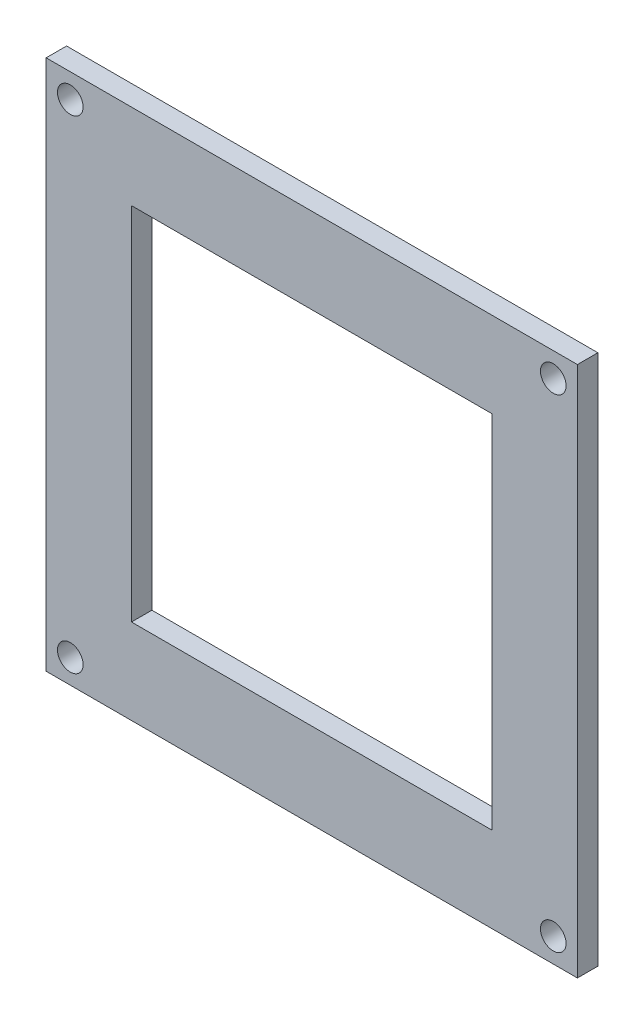
ISO-10303-21;
HEADER;
FILE_DESCRIPTION(('STEP AP214'),'2;1');
FILE_NAME('part.step','',(''),(''),'','','');
FILE_SCHEMA(('AUTOMOTIVE_DESIGN { 1 0 10303 214 1 1 1 1 }'));
ENDSEC;
DATA;
#1=APPLICATION_CONTEXT('core data for automotive mechanical design processes');
#2=APPLICATION_PROTOCOL_DEFINITION('international standard','automotive_design',2000,#1);
#3=PRODUCT_CONTEXT('',#1,'mechanical');
#4=PRODUCT('Part','Part','',(#3));
#5=PRODUCT_RELATED_PRODUCT_CATEGORY('part','',(#4));
#6=PRODUCT_DEFINITION_FORMATION('','',#4);
#7=PRODUCT_DEFINITION_CONTEXT('part definition',#1,'design');
#8=PRODUCT_DEFINITION('design','',#6,#7);
#9=PRODUCT_DEFINITION_SHAPE('','',#8);
#10=(LENGTH_UNIT() NAMED_UNIT(*) SI_UNIT(.MILLI.,.METRE.));
#11=(NAMED_UNIT(*) PLANE_ANGLE_UNIT() SI_UNIT($,.RADIAN.));
#12=(NAMED_UNIT(*) SI_UNIT($,.STERADIAN.) SOLID_ANGLE_UNIT());
#13=UNCERTAINTY_MEASURE_WITH_UNIT(LENGTH_MEASURE(1.E-05),#10,'distance_accuracy_value','');
#14=(GEOMETRIC_REPRESENTATION_CONTEXT(3) GLOBAL_UNCERTAINTY_ASSIGNED_CONTEXT((#13)) GLOBAL_UNIT_ASSIGNED_CONTEXT((#10,
#11,#12)) REPRESENTATION_CONTEXT('',''));
#15=CARTESIAN_POINT('',(0.,0.,0.));
#16=DIRECTION('',(0.,0.,1.));
#17=DIRECTION('',(1.,0.,0.));
#18=AXIS2_PLACEMENT_3D('',#15,#16,#17);
#19=CARTESIAN_POINT('',(0.,0.,2.54));
#20=DIRECTION('',(0.,0.,1.));
#21=DIRECTION('',(1.,0.,0.));
#22=AXIS2_PLACEMENT_3D('',#19,#20,#21);
#23=PLANE('',#22);
#24=CARTESIAN_POINT('',(-30.,-30.,2.54));
#25=DIRECTION('',(0.,0.,1.));
#26=DIRECTION('',(1.,0.,0.));
#27=AXIS2_PLACEMENT_3D('',#24,#25,#26);
#28=CIRCLE('',#27,1.59);
#29=CARTESIAN_POINT('',(-28.41,-30.,2.54));
#30=VERTEX_POINT('',#29);
#31=EDGE_CURVE('E253',#30,#30,#28,.T.);
#32=ORIENTED_EDGE('',*,*,#31,.F.);
#33=EDGE_LOOP('',(#32));
#34=FACE_BOUND('',#33,.T.);
#35=CARTESIAN_POINT('',(30.,30.,2.54));
#36=DIRECTION('',(0.,0.,1.));
#37=DIRECTION('',(1.,0.,0.));
#38=AXIS2_PLACEMENT_3D('',#35,#36,#37);
#39=CIRCLE('',#38,1.59);
#40=CARTESIAN_POINT('',(31.59,30.,2.54));
#41=VERTEX_POINT('',#40);
#42=EDGE_CURVE('E135',#41,#41,#39,.T.);
#43=ORIENTED_EDGE('',*,*,#42,.F.);
#44=EDGE_LOOP('',(#43));
#45=FACE_BOUND('',#44,.T.);
#46=DIRECTION('',(0.,1.,0.));
#47=VECTOR('',#46,1.);
#48=CARTESIAN_POINT('',(33.,33.,2.54));
#49=LINE('',#48,#47);
#50=CARTESIAN_POINT('',(33.,-33.,2.54));
#51=VERTEX_POINT('',#50);
#52=CARTESIAN_POINT('',(33.,33.,2.54));
#53=VERTEX_POINT('',#52);
#54=EDGE_CURVE('E145',#51,#53,#49,.T.);
#55=ORIENTED_EDGE('',*,*,#54,.T.);
#56=DIRECTION('',(-1.,0.,0.));
#57=VECTOR('',#56,1.);
#58=CARTESIAN_POINT('',(-33.,33.,2.54));
#59=LINE('',#58,#57);
#60=CARTESIAN_POINT('',(-33.,33.,2.54));
#61=VERTEX_POINT('',#60);
#62=EDGE_CURVE('E148',#53,#61,#59,.T.);
#63=ORIENTED_EDGE('',*,*,#62,.T.);
#64=DIRECTION('',(0.,-1.,0.));
#65=VECTOR('',#64,1.);
#66=CARTESIAN_POINT('',(-33.,33.,2.54));
#67=LINE('',#66,#65);
#68=CARTESIAN_POINT('',(-33.,-33.,2.54));
#69=VERTEX_POINT('',#68);
#70=EDGE_CURVE('E151',#61,#69,#67,.T.);
#71=ORIENTED_EDGE('',*,*,#70,.T.);
#72=DIRECTION('',(1.,0.,0.));
#73=VECTOR('',#72,1.);
#74=CARTESIAN_POINT('',(-33.,-33.,2.54));
#75=LINE('',#74,#73);
#76=EDGE_CURVE('E153',#69,#51,#75,.T.);
#77=ORIENTED_EDGE('',*,*,#76,.T.);
#78=EDGE_LOOP('',(#55,#63,#71,#77));
#79=FACE_BOUND('',#78,.T.);
#80=DIRECTION('',(-1.,0.,0.));
#81=VECTOR('',#80,1.);
#82=CARTESIAN_POINT('',(-22.4,22.4,2.54));
#83=LINE('',#82,#81);
#84=CARTESIAN_POINT('',(22.4,22.4,2.54));
#85=VERTEX_POINT('',#84);
#86=CARTESIAN_POINT('',(-22.4,22.4,2.54));
#87=VERTEX_POINT('',#86);
#88=EDGE_CURVE('E114',#85,#87,#83,.T.);
#89=ORIENTED_EDGE('',*,*,#88,.F.);
#90=DIRECTION('',(0.,1.,0.));
#91=VECTOR('',#90,1.);
#92=CARTESIAN_POINT('',(22.4,22.4,2.54));
#93=LINE('',#92,#91);
#94=CARTESIAN_POINT('',(22.4,-22.4,2.54));
#95=VERTEX_POINT('',#94);
#96=EDGE_CURVE('E106',#95,#85,#93,.T.);
#97=ORIENTED_EDGE('',*,*,#96,.F.);
#98=DIRECTION('',(1.,0.,0.));
#99=VECTOR('',#98,1.);
#100=CARTESIAN_POINT('',(-22.4,-22.4,2.54));
#101=LINE('',#100,#99);
#102=CARTESIAN_POINT('',(-22.4,-22.4,2.54));
#103=VERTEX_POINT('',#102);
#104=EDGE_CURVE('E129',#103,#95,#101,.T.);
#105=ORIENTED_EDGE('',*,*,#104,.F.);
#106=DIRECTION('',(0.,-1.,0.));
#107=VECTOR('',#106,1.);
#108=CARTESIAN_POINT('',(-22.4,22.4,2.54));
#109=LINE('',#108,#107);
#110=EDGE_CURVE('E127',#87,#103,#109,.T.);
#111=ORIENTED_EDGE('',*,*,#110,.F.);
#112=EDGE_LOOP('',(#89,#97,#105,#111));
#113=FACE_BOUND('',#112,.T.);
#114=CARTESIAN_POINT('',(-30.,30.,2.54));
#115=DIRECTION('',(0.,0.,1.));
#116=DIRECTION('',(1.,0.,0.));
#117=AXIS2_PLACEMENT_3D('',#114,#115,#116);
#118=CIRCLE('',#117,1.59);
#119=CARTESIAN_POINT('',(-28.41,30.,2.54));
#120=VERTEX_POINT('',#119);
#121=EDGE_CURVE('E259',#120,#120,#118,.T.);
#122=ORIENTED_EDGE('',*,*,#121,.F.);
#123=EDGE_LOOP('',(#122));
#124=FACE_BOUND('',#123,.T.);
#125=CARTESIAN_POINT('',(30.,-30.,2.54));
#126=DIRECTION('',(0.,0.,1.));
#127=DIRECTION('',(1.,0.,0.));
#128=AXIS2_PLACEMENT_3D('',#125,#126,#127);
#129=CIRCLE('',#128,1.59);
#130=CARTESIAN_POINT('',(31.59,-30.,2.54));
#131=VERTEX_POINT('',#130);
#132=EDGE_CURVE('E244',#131,#131,#129,.T.);
#133=ORIENTED_EDGE('',*,*,#132,.F.);
#134=EDGE_LOOP('',(#133));
#135=FACE_BOUND('',#134,.T.);
#136=ADVANCED_FACE('F41',(#34,#45,#79,#113,#124,#135),#23,.T.);
#137=CARTESIAN_POINT('',(0.,0.,0.));
#138=DIRECTION('',(0.,0.,1.));
#139=DIRECTION('',(1.,0.,0.));
#140=AXIS2_PLACEMENT_3D('',#137,#138,#139);
#141=PLANE('',#140);
#142=DIRECTION('',(0.,1.,0.));
#143=VECTOR('',#142,1.);
#144=CARTESIAN_POINT('',(33.,33.,0.));
#145=LINE('',#144,#143);
#146=CARTESIAN_POINT('',(33.,-33.,0.));
#147=VERTEX_POINT('',#146);
#148=CARTESIAN_POINT('',(33.,33.,0.));
#149=VERTEX_POINT('',#148);
#150=EDGE_CURVE('E122',#147,#149,#145,.T.);
#151=ORIENTED_EDGE('',*,*,#150,.F.);
#152=DIRECTION('',(1.,0.,0.));
#153=VECTOR('',#152,1.);
#154=CARTESIAN_POINT('',(-33.,-33.,0.));
#155=LINE('',#154,#153);
#156=CARTESIAN_POINT('',(-33.,-33.,0.));
#157=VERTEX_POINT('',#156);
#158=EDGE_CURVE('E149',#157,#147,#155,.T.);
#159=ORIENTED_EDGE('',*,*,#158,.F.);
#160=DIRECTION('',(0.,-1.,0.));
#161=VECTOR('',#160,1.);
#162=CARTESIAN_POINT('',(-33.,33.,0.));
#163=LINE('',#162,#161);
#164=CARTESIAN_POINT('',(-33.,33.,0.));
#165=VERTEX_POINT('',#164);
#166=EDGE_CURVE('E160',#165,#157,#163,.T.);
#167=ORIENTED_EDGE('',*,*,#166,.F.);
#168=DIRECTION('',(-1.,0.,0.));
#169=VECTOR('',#168,1.);
#170=CARTESIAN_POINT('',(-33.,33.,0.));
#171=LINE('',#170,#169);
#172=EDGE_CURVE('E158',#149,#165,#171,.T.);
#173=ORIENTED_EDGE('',*,*,#172,.F.);
#174=EDGE_LOOP('',(#151,#159,#167,#173));
#175=FACE_BOUND('',#174,.T.);
#176=DIRECTION('',(0.,1.,0.));
#177=VECTOR('',#176,1.);
#178=CARTESIAN_POINT('',(22.4,22.4,0.));
#179=LINE('',#178,#177);
#180=CARTESIAN_POINT('',(22.4,-22.4,0.));
#181=VERTEX_POINT('',#180);
#182=CARTESIAN_POINT('',(22.4,22.4,0.));
#183=VERTEX_POINT('',#182);
#184=EDGE_CURVE('E64',#181,#183,#179,.T.);
#185=ORIENTED_EDGE('',*,*,#184,.T.);
#186=DIRECTION('',(-1.,0.,0.));
#187=VECTOR('',#186,1.);
#188=CARTESIAN_POINT('',(-22.4,22.4,0.));
#189=LINE('',#188,#187);
#190=CARTESIAN_POINT('',(-22.4,22.4,0.));
#191=VERTEX_POINT('',#190);
#192=EDGE_CURVE('E121',#183,#191,#189,.T.);
#193=ORIENTED_EDGE('',*,*,#192,.T.);
#194=DIRECTION('',(0.,-1.,0.));
#195=VECTOR('',#194,1.);
#196=CARTESIAN_POINT('',(-22.4,22.4,0.));
#197=LINE('',#196,#195);
#198=CARTESIAN_POINT('',(-22.4,-22.4,0.));
#199=VERTEX_POINT('',#198);
#200=EDGE_CURVE('E137',#191,#199,#197,.T.);
#201=ORIENTED_EDGE('',*,*,#200,.T.);
#202=DIRECTION('',(1.,0.,0.));
#203=VECTOR('',#202,1.);
#204=CARTESIAN_POINT('',(-22.4,-22.4,0.));
#205=LINE('',#204,#203);
#206=EDGE_CURVE('E115',#199,#181,#205,.T.);
#207=ORIENTED_EDGE('',*,*,#206,.T.);
#208=EDGE_LOOP('',(#185,#193,#201,#207));
#209=FACE_BOUND('',#208,.T.);
#210=CARTESIAN_POINT('',(30.,30.,0.));
#211=DIRECTION('',(0.,0.,1.));
#212=DIRECTION('',(1.,0.,0.));
#213=AXIS2_PLACEMENT_3D('',#210,#211,#212);
#214=CIRCLE('',#213,1.59);
#215=CARTESIAN_POINT('',(31.59,30.,0.));
#216=VERTEX_POINT('',#215);
#217=EDGE_CURVE('E262',#216,#216,#214,.T.);
#218=ORIENTED_EDGE('',*,*,#217,.T.);
#219=EDGE_LOOP('',(#218));
#220=FACE_BOUND('',#219,.T.);
#221=CARTESIAN_POINT('',(-30.,30.,0.));
#222=DIRECTION('',(0.,0.,1.));
#223=DIRECTION('',(1.,0.,0.));
#224=AXIS2_PLACEMENT_3D('',#221,#222,#223);
#225=CIRCLE('',#224,1.59);
#226=CARTESIAN_POINT('',(-28.41,30.,0.));
#227=VERTEX_POINT('',#226);
#228=EDGE_CURVE('E256',#227,#227,#225,.T.);
#229=ORIENTED_EDGE('',*,*,#228,.T.);
#230=EDGE_LOOP('',(#229));
#231=FACE_BOUND('',#230,.T.);
#232=CARTESIAN_POINT('',(-30.,-30.,0.));
#233=DIRECTION('',(0.,0.,1.));
#234=DIRECTION('',(1.,0.,0.));
#235=AXIS2_PLACEMENT_3D('',#232,#233,#234);
#236=CIRCLE('',#235,1.59);
#237=CARTESIAN_POINT('',(-28.41,-30.,0.));
#238=VERTEX_POINT('',#237);
#239=EDGE_CURVE('E250',#238,#238,#236,.T.);
#240=ORIENTED_EDGE('',*,*,#239,.T.);
#241=EDGE_LOOP('',(#240));
#242=FACE_BOUND('',#241,.T.);
#243=CARTESIAN_POINT('',(30.,-30.,0.));
#244=DIRECTION('',(0.,0.,1.));
#245=DIRECTION('',(1.,0.,0.));
#246=AXIS2_PLACEMENT_3D('',#243,#244,#245);
#247=CIRCLE('',#246,1.59);
#248=CARTESIAN_POINT('',(31.59,-30.,0.));
#249=VERTEX_POINT('',#248);
#250=EDGE_CURVE('E247',#249,#249,#247,.T.);
#251=ORIENTED_EDGE('',*,*,#250,.T.);
#252=EDGE_LOOP('',(#251));
#253=FACE_BOUND('',#252,.T.);
#254=ADVANCED_FACE('F178',(#175,#209,#220,#231,#242,#253),#141,.F.);
#255=CARTESIAN_POINT('',(33.,33.,2.54));
#256=DIRECTION('',(-1.,0.,0.));
#257=DIRECTION('',(0.,-1.,0.));
#258=AXIS2_PLACEMENT_3D('',#255,#256,#257);
#259=PLANE('',#258);
#260=ORIENTED_EDGE('',*,*,#150,.T.);
#261=DIRECTION('',(0.,0.,-1.));
#262=VECTOR('',#261,1.);
#263=CARTESIAN_POINT('',(33.,33.,2.54));
#264=LINE('',#263,#262);
#265=EDGE_CURVE('E11',#53,#149,#264,.T.);
#266=ORIENTED_EDGE('',*,*,#265,.F.);
#267=ORIENTED_EDGE('',*,*,#54,.F.);
#268=DIRECTION('',(0.,0.,-1.));
#269=VECTOR('',#268,1.);
#270=CARTESIAN_POINT('',(33.,-33.,2.54));
#271=LINE('',#270,#269);
#272=EDGE_CURVE('E155',#51,#147,#271,.T.);
#273=ORIENTED_EDGE('',*,*,#272,.T.);
#274=EDGE_LOOP('',(#260,#266,#267,#273));
#275=FACE_BOUND('',#274,.T.);
#276=ADVANCED_FACE('F43',(#275),#259,.F.);
#277=CARTESIAN_POINT('',(-33.,33.,2.54));
#278=DIRECTION('',(0.,-1.,0.));
#279=DIRECTION('',(0.,0.,-1.));
#280=AXIS2_PLACEMENT_3D('',#277,#278,#279);
#281=PLANE('',#280);
#282=ORIENTED_EDGE('',*,*,#172,.T.);
#283=DIRECTION('',(0.,0.,-1.));
#284=VECTOR('',#283,1.);
#285=CARTESIAN_POINT('',(-33.,33.,2.54));
#286=LINE('',#285,#284);
#287=EDGE_CURVE('E49',#61,#165,#286,.T.);
#288=ORIENTED_EDGE('',*,*,#287,.F.);
#289=ORIENTED_EDGE('',*,*,#62,.F.);
#290=ORIENTED_EDGE('',*,*,#265,.T.);
#291=EDGE_LOOP('',(#282,#288,#289,#290));
#292=FACE_BOUND('',#291,.T.);
#293=ADVANCED_FACE('F188',(#292),#281,.F.);
#294=CARTESIAN_POINT('',(-33.,33.,2.54));
#295=DIRECTION('',(1.,0.,0.));
#296=DIRECTION('',(0.,0.,-1.));
#297=AXIS2_PLACEMENT_3D('',#294,#295,#296);
#298=PLANE('',#297);
#299=ORIENTED_EDGE('',*,*,#166,.T.);
#300=DIRECTION('',(0.,0.,-1.));
#301=VECTOR('',#300,1.);
#302=CARTESIAN_POINT('',(-33.,-33.,2.54));
#303=LINE('',#302,#301);
#304=EDGE_CURVE('E165',#69,#157,#303,.T.);
#305=ORIENTED_EDGE('',*,*,#304,.F.);
#306=ORIENTED_EDGE('',*,*,#70,.F.);
#307=ORIENTED_EDGE('',*,*,#287,.T.);
#308=EDGE_LOOP('',(#299,#305,#306,#307));
#309=FACE_BOUND('',#308,.T.);
#310=ADVANCED_FACE('F172',(#309),#298,.F.);
#311=CARTESIAN_POINT('',(-33.,-33.,2.54));
#312=DIRECTION('',(0.,1.,0.));
#313=DIRECTION('',(-1.,0.,0.));
#314=AXIS2_PLACEMENT_3D('',#311,#312,#313);
#315=PLANE('',#314);
#316=ORIENTED_EDGE('',*,*,#158,.T.);
#317=ORIENTED_EDGE('',*,*,#272,.F.);
#318=ORIENTED_EDGE('',*,*,#76,.F.);
#319=ORIENTED_EDGE('',*,*,#304,.T.);
#320=EDGE_LOOP('',(#316,#317,#318,#319));
#321=FACE_BOUND('',#320,.T.);
#322=ADVANCED_FACE('F182',(#321),#315,.F.);
#323=CARTESIAN_POINT('',(22.4,22.4,2.54));
#324=DIRECTION('',(-1.,0.,0.));
#325=DIRECTION('',(0.,0.,1.));
#326=AXIS2_PLACEMENT_3D('',#323,#324,#325);
#327=PLANE('',#326);
#328=ORIENTED_EDGE('',*,*,#184,.F.);
#329=DIRECTION('',(0.,0.,-1.));
#330=VECTOR('',#329,1.);
#331=CARTESIAN_POINT('',(22.4,-22.4,2.54));
#332=LINE('',#331,#330);
#333=EDGE_CURVE('E110',#95,#181,#332,.T.);
#334=ORIENTED_EDGE('',*,*,#333,.F.);
#335=ORIENTED_EDGE('',*,*,#96,.T.);
#336=DIRECTION('',(0.,0.,-1.));
#337=VECTOR('',#336,1.);
#338=CARTESIAN_POINT('',(22.4,22.4,2.54));
#339=LINE('',#338,#337);
#340=EDGE_CURVE('E109',#85,#183,#339,.T.);
#341=ORIENTED_EDGE('',*,*,#340,.T.);
#342=EDGE_LOOP('',(#328,#334,#335,#341));
#343=FACE_BOUND('',#342,.T.);
#344=ADVANCED_FACE('F108',(#343),#327,.T.);
#345=CARTESIAN_POINT('',(-22.4,22.4,2.54));
#346=DIRECTION('',(0.,-1.,0.));
#347=DIRECTION('',(0.,0.,-1.));
#348=AXIS2_PLACEMENT_3D('',#345,#346,#347);
#349=PLANE('',#348);
#350=ORIENTED_EDGE('',*,*,#192,.F.);
#351=ORIENTED_EDGE('',*,*,#340,.F.);
#352=ORIENTED_EDGE('',*,*,#88,.T.);
#353=DIRECTION('',(0.,0.,-1.));
#354=VECTOR('',#353,1.);
#355=CARTESIAN_POINT('',(-22.4,22.4,2.54));
#356=LINE('',#355,#354);
#357=EDGE_CURVE('E123',#87,#191,#356,.T.);
#358=ORIENTED_EDGE('',*,*,#357,.T.);
#359=EDGE_LOOP('',(#350,#351,#352,#358));
#360=FACE_BOUND('',#359,.T.);
#361=ADVANCED_FACE('F118',(#360),#349,.T.);
#362=CARTESIAN_POINT('',(-22.4,22.4,2.54));
#363=DIRECTION('',(1.,0.,0.));
#364=DIRECTION('',(0.,0.,-1.));
#365=AXIS2_PLACEMENT_3D('',#362,#363,#364);
#366=PLANE('',#365);
#367=ORIENTED_EDGE('',*,*,#200,.F.);
#368=ORIENTED_EDGE('',*,*,#357,.F.);
#369=ORIENTED_EDGE('',*,*,#110,.T.);
#370=DIRECTION('',(0.,0.,-1.));
#371=VECTOR('',#370,1.);
#372=CARTESIAN_POINT('',(-22.4,-22.4,2.54));
#373=LINE('',#372,#371);
#374=EDGE_CURVE('E56',#103,#199,#373,.T.);
#375=ORIENTED_EDGE('',*,*,#374,.T.);
#376=EDGE_LOOP('',(#367,#368,#369,#375));
#377=FACE_BOUND('',#376,.T.);
#378=ADVANCED_FACE('F214',(#377),#366,.T.);
#379=CARTESIAN_POINT('',(-22.4,-22.4,2.54));
#380=DIRECTION('',(0.,1.,0.));
#381=DIRECTION('',(0.,0.,1.));
#382=AXIS2_PLACEMENT_3D('',#379,#380,#381);
#383=PLANE('',#382);
#384=ORIENTED_EDGE('',*,*,#206,.F.);
#385=ORIENTED_EDGE('',*,*,#374,.F.);
#386=ORIENTED_EDGE('',*,*,#104,.T.);
#387=ORIENTED_EDGE('',*,*,#333,.T.);
#388=EDGE_LOOP('',(#384,#385,#386,#387));
#389=FACE_BOUND('',#388,.T.);
#390=ADVANCED_FACE('F218',(#389),#383,.T.);
#391=CARTESIAN_POINT('',(30.,30.,2.54));
#392=DIRECTION('',(0.,0.,-1.));
#393=DIRECTION('',(-1.,0.,0.));
#394=AXIS2_PLACEMENT_3D('',#391,#392,#393);
#395=CYLINDRICAL_SURFACE('',#394,1.59);
#396=ORIENTED_EDGE('',*,*,#42,.T.);
#397=EDGE_LOOP('',(#396));
#398=FACE_BOUND('',#397,.T.);
#399=ORIENTED_EDGE('',*,*,#217,.F.);
#400=EDGE_LOOP('',(#399));
#401=FACE_BOUND('',#400,.T.);
#402=ADVANCED_FACE('F224',(#398,#401),#395,.F.);
#403=CARTESIAN_POINT('',(-30.,30.,2.54));
#404=DIRECTION('',(0.,0.,-1.));
#405=DIRECTION('',(-1.,0.,0.));
#406=AXIS2_PLACEMENT_3D('',#403,#404,#405);
#407=CYLINDRICAL_SURFACE('',#406,1.59);
#408=ORIENTED_EDGE('',*,*,#121,.T.);
#409=EDGE_LOOP('',(#408));
#410=FACE_BOUND('',#409,.T.);
#411=ORIENTED_EDGE('',*,*,#228,.F.);
#412=EDGE_LOOP('',(#411));
#413=FACE_BOUND('',#412,.T.);
#414=ADVANCED_FACE('F227',(#410,#413),#407,.F.);
#415=CARTESIAN_POINT('',(-30.,-30.,2.54));
#416=DIRECTION('',(0.,0.,-1.));
#417=DIRECTION('',(-1.,0.,0.));
#418=AXIS2_PLACEMENT_3D('',#415,#416,#417);
#419=CYLINDRICAL_SURFACE('',#418,1.59);
#420=ORIENTED_EDGE('',*,*,#31,.T.);
#421=EDGE_LOOP('',(#420));
#422=FACE_BOUND('',#421,.T.);
#423=ORIENTED_EDGE('',*,*,#239,.F.);
#424=EDGE_LOOP('',(#423));
#425=FACE_BOUND('',#424,.T.);
#426=ADVANCED_FACE('F231',(#422,#425),#419,.F.);
#427=CARTESIAN_POINT('',(30.,-30.,2.54));
#428=DIRECTION('',(0.,0.,-1.));
#429=DIRECTION('',(-1.,0.,0.));
#430=AXIS2_PLACEMENT_3D('',#427,#428,#429);
#431=CYLINDRICAL_SURFACE('',#430,1.59);
#432=ORIENTED_EDGE('',*,*,#132,.T.);
#433=EDGE_LOOP('',(#432));
#434=FACE_BOUND('',#433,.T.);
#435=ORIENTED_EDGE('',*,*,#250,.F.);
#436=EDGE_LOOP('',(#435));
#437=FACE_BOUND('',#436,.T.);
#438=ADVANCED_FACE('F235',(#434,#437),#431,.F.);
#439=CLOSED_SHELL('',(#136,#254,#276,#293,#310,#322,#344,#361,#378,#390,#402,#414,#426,#438));
#440=MANIFOLD_SOLID_BREP('B2',#439);
#441=ADVANCED_BREP_SHAPE_REPRESENTATION('',(#18,#440),#14);
#442=SHAPE_DEFINITION_REPRESENTATION(#9,#441);
ENDSEC;
END-ISO-10303-21;
